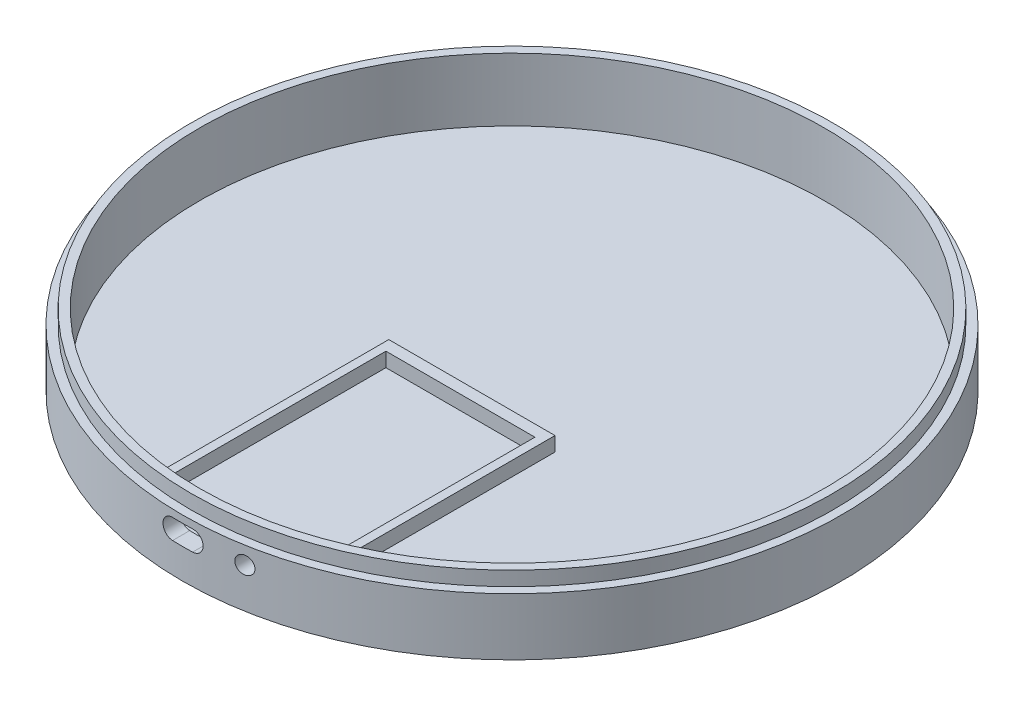
ISO-10303-21;
HEADER;
FILE_DESCRIPTION(('STEP AP214'),'2;1');
FILE_NAME('part.step','',(''),(''),'','','');
FILE_SCHEMA(('AUTOMOTIVE_DESIGN { 1 0 10303 214 1 1 1 1 }'));
ENDSEC;
DATA;
#1=APPLICATION_CONTEXT('core data for automotive mechanical design processes');
#2=APPLICATION_PROTOCOL_DEFINITION('international standard','automotive_design',2000,#1);
#3=PRODUCT_CONTEXT('',#1,'mechanical');
#4=PRODUCT('Part','Part','',(#3));
#5=PRODUCT_RELATED_PRODUCT_CATEGORY('part','',(#4));
#6=PRODUCT_DEFINITION_FORMATION('','',#4);
#7=PRODUCT_DEFINITION_CONTEXT('part definition',#1,'design');
#8=PRODUCT_DEFINITION('design','',#6,#7);
#9=PRODUCT_DEFINITION_SHAPE('','',#8);
#10=(LENGTH_UNIT() NAMED_UNIT(*) SI_UNIT(.MILLI.,.METRE.));
#11=(NAMED_UNIT(*) PLANE_ANGLE_UNIT() SI_UNIT($,.RADIAN.));
#12=(NAMED_UNIT(*) SI_UNIT($,.STERADIAN.) SOLID_ANGLE_UNIT());
#13=UNCERTAINTY_MEASURE_WITH_UNIT(LENGTH_MEASURE(1.E-05),#10,'distance_accuracy_value','');
#14=(GEOMETRIC_REPRESENTATION_CONTEXT(3) GLOBAL_UNCERTAINTY_ASSIGNED_CONTEXT((#13)) GLOBAL_UNIT_ASSIGNED_CONTEXT((#10,
#11,#12)) REPRESENTATION_CONTEXT('',''));
#15=CARTESIAN_POINT('',(0.,0.,0.));
#16=DIRECTION('',(0.,0.,1.));
#17=DIRECTION('',(1.,0.,0.));
#18=AXIS2_PLACEMENT_3D('',#15,#16,#17);
#19=CARTESIAN_POINT('',(0.,20.,0.));
#20=DIRECTION('',(0.,-1.,0.));
#21=DIRECTION('',(0.,0.,-1.));
#22=AXIS2_PLACEMENT_3D('',#19,#20,#21);
#23=CYLINDRICAL_SURFACE('',#22,115.);
#24=CARTESIAN_POINT('',(0.,20.,0.));
#25=DIRECTION('',(0.,1.,0.));
#26=DIRECTION('',(0.,0.,1.));
#27=AXIS2_PLACEMENT_3D('',#24,#25,#26);
#28=CIRCLE('',#27,115.);
#29=CARTESIAN_POINT('',(0.,20.,115.));
#30=VERTEX_POINT('',#29);
#31=EDGE_CURVE('E242',#30,#30,#28,.T.);
#32=ORIENTED_EDGE('',*,*,#31,.F.);
#33=EDGE_LOOP('',(#32));
#34=FACE_BOUND('',#33,.T.);
#35=CARTESIAN_POINT('',(0.,0.,0.));
#36=DIRECTION('',(0.,1.,0.));
#37=DIRECTION('',(0.,0.,1.));
#38=AXIS2_PLACEMENT_3D('',#35,#36,#37);
#39=CIRCLE('',#38,115.);
#40=CARTESIAN_POINT('',(0.,0.,115.));
#41=VERTEX_POINT('',#40);
#42=EDGE_CURVE('E245',#41,#41,#39,.T.);
#43=ORIENTED_EDGE('',*,*,#42,.T.);
#44=EDGE_LOOP('',(#43));
#45=FACE_BOUND('',#44,.T.);
#46=CARTESIAN_POINT('',(0.,10.5,0.));
#47=DIRECTION('',(0.,1.,0.));
#48=DIRECTION('',(0.,0.,1.));
#49=AXIS2_PLACEMENT_3D('',#46,#47,#48);
#50=CIRCLE('',#49,115.);
#51=CARTESIAN_POINT('',(-3.5,10.5,114.946726791153));
#52=VERTEX_POINT('',#51);
#53=CARTESIAN_POINT('',(3.5,10.5,114.946726791153));
#54=VERTEX_POINT('',#53);
#55=EDGE_CURVE('E153',#52,#54,#50,.T.);
#56=ORIENTED_EDGE('',*,*,#55,.F.);
#57=CARTESIAN_POINT('',(-3.5,17.5,114.946726791153));
#58=CARTESIAN_POINT('',(-3.5985085013734,17.5000094239052,114.943728548544));
#59=CARTESIAN_POINT('',(-3.69700840686518,17.4958412138312,114.940601381051));
#60=CARTESIAN_POINT('',(-3.89329476689758,17.4792245324398,114.934119494774));
#61=CARTESIAN_POINT('',(-3.99108125861865,17.4667764957977,114.930764787945));
#62=CARTESIAN_POINT('',(-4.18518500594403,17.4336870886553,114.923860290826));
#63=CARTESIAN_POINT('',(-4.2815032702209,17.4130516331743,114.920310642965));
#64=CARTESIAN_POINT('',(-4.47202899821757,17.3637562129467,114.913054369222));
#65=CARTESIAN_POINT('',(-4.56623648473751,17.3350963349233,114.909347745039));
#66=CARTESIAN_POINT('',(-4.84477792637925,17.2373159129675,114.898052663532));
#67=CARTESIAN_POINT('',(-5.02511751807623,17.1563797273345,114.890285884088));
#68=CARTESIAN_POINT('',(-5.36950741271024,16.9654273228237,114.874706603238));
#69=CARTESIAN_POINT('',(-5.53356071692435,16.8554164756314,114.866894110539));
#70=CARTESIAN_POINT('',(-5.84096970797494,16.6093326995222,114.851672961501));
#71=CARTESIAN_POINT('',(-5.9843163846608,16.4732484847635,114.844264481831));
#72=CARTESIAN_POINT('',(-6.24613821503049,16.178884862841,114.830322663342));
#73=CARTESIAN_POINT('',(-6.36460972039862,16.0206022056138,114.823789452947));
#74=CARTESIAN_POINT('',(-6.57321709790687,15.6864468493145,114.812036665657));
#75=CARTESIAN_POINT('',(-6.6633710483905,15.5105854676917,114.806816251081));
#76=CARTESIAN_POINT('',(-6.81285722025856,15.1461921693224,114.798042738691));
#77=CARTESIAN_POINT('',(-6.87219168694474,14.9576611767296,114.794489519418));
#78=CARTESIAN_POINT('',(-6.95827542124104,14.5735864123909,114.78930385353));
#79=CARTESIAN_POINT('',(-6.98507561069189,14.378054094138,114.787668405404));
#80=CARTESIAN_POINT('',(-7.00548994842089,13.9852545401416,114.786424373809));
#81=CARTESIAN_POINT('',(-6.99910360177368,13.787987278568,114.786815820569));
#82=CARTESIAN_POINT('',(-6.95335300169849,13.3975514131692,114.789596196769));
#83=CARTESIAN_POINT('',(-6.91402515478759,13.2043785258437,114.791982921048));
#84=CARTESIAN_POINT('',(-6.80356683758188,12.8273842364094,114.798582368508));
#85=CARTESIAN_POINT('',(-6.73243639605848,12.6435628258405,114.802795090037));
#86=CARTESIAN_POINT('',(-6.56035623343739,12.2903711385296,114.812756787597));
#87=CARTESIAN_POINT('',(-6.45938988818336,12.1210089862771,114.818506619915));
#88=CARTESIAN_POINT('',(-6.23052997990829,11.8016374731536,114.831152499812));
#89=CARTESIAN_POINT('',(-6.10263748907556,11.6516273420764,114.83804850175));
#90=CARTESIAN_POINT('',(-5.82334289664208,11.3749716754757,114.852549894781));
#91=CARTESIAN_POINT('',(-5.67190665015502,11.2483606681907,114.860156309668));
#92=CARTESIAN_POINT('',(-5.34988350176124,11.0223109269201,114.875605255252));
#93=CARTESIAN_POINT('',(-5.17929040221174,10.9228810225269,114.883447861757));
#94=CARTESIAN_POINT('',(-4.82356273663683,10.7539177915118,114.898933815286));
#95=CARTESIAN_POINT('',(-4.63840398775731,10.6844354797907,114.906576801625));
#96=CARTESIAN_POINT('',(-4.25916695250358,10.5776698323713,114.921257091163));
#97=CARTESIAN_POINT('',(-4.06510278564965,10.5403372627583,114.928295305571));
#98=CARTESIAN_POINT('',(-3.80810902209697,10.5130375919962,114.93694852287));
#99=CARTESIAN_POINT('',(-3.74653678539975,10.5081460481525,114.938972011159));
#100=CARTESIAN_POINT('',(-3.62331853368298,10.5016317027061,114.94292208372));
#101=CARTESIAN_POINT('',(-3.56167280848977,10.5000035155762,114.944848822526));
#102=CARTESIAN_POINT('',(-3.5,10.5,114.946726791153));
#103=B_SPLINE_CURVE_WITH_KNOTS('',3,(#57,#58,#59,#60,#61,#62,#63,#64,#65,#66,#67,#68,#69,#70,
#71,#72,#73,#74,#75,#76,#77,#78,#79,#80,#81,#82,#83,#84,#85,#86,#87,#88,#89,#90,#91,#92,#93,#94,
#95,#96,#97,#98,#99,#100,#101,#102),.UNSPECIFIED.,.F.,.F.,(4,2,2,2,2,2,2,2,2,2,2,2,2,2,2,2,2,2,
2,2,2,2,4),(0.,0.29556580441684,0.591116093409818,0.886453249089045,1.18178721306328,
1.77219454413175,2.36249287072694,2.95304728721114,3.54368825692011,4.13395138271613,
4.72417149984937,5.31346662312127,5.902770534835,6.49142401356984,7.08007695975831,
7.66905851573047,8.25801662312783,8.84783698880906,9.43784872647563,10.0288615983221,
10.6189677790349,10.8043054324249,10.989336969857),.UNSPECIFIED.);
#104=CARTESIAN_POINT('',(-3.5,17.5,114.946726791153));
#105=VERTEX_POINT('',#104);
#106=EDGE_CURVE('E146',#105,#52,#103,.T.);
#107=ORIENTED_EDGE('',*,*,#106,.F.);
#108=CARTESIAN_POINT('',(0.,17.5,0.));
#109=DIRECTION('',(0.,-1.,0.));
#110=DIRECTION('',(0.,0.,-1.));
#111=AXIS2_PLACEMENT_3D('',#108,#109,#110);
#112=CIRCLE('',#111,115.);
#113=CARTESIAN_POINT('',(3.5,17.5,114.946726791153));
#114=VERTEX_POINT('',#113);
#115=EDGE_CURVE('E132',#114,#105,#112,.T.);
#116=ORIENTED_EDGE('',*,*,#115,.F.);
#117=CARTESIAN_POINT('',(3.5,10.5,114.946726791153));
#118=CARTESIAN_POINT('',(3.59850850137341,10.4999905760948,114.943728548544));
#119=CARTESIAN_POINT('',(3.69700840686518,10.5041587861688,114.940601381051));
#120=CARTESIAN_POINT('',(3.89329476689758,10.5207754675602,114.934119494774));
#121=CARTESIAN_POINT('',(3.99108125861865,10.5332235042023,114.930764787945));
#122=CARTESIAN_POINT('',(4.18518500594403,10.5663129113447,114.923860290826));
#123=CARTESIAN_POINT('',(4.2815032702209,10.5869483668257,114.920310642965));
#124=CARTESIAN_POINT('',(4.47202899821757,10.6362437870533,114.913054369222));
#125=CARTESIAN_POINT('',(4.56623648473752,10.6649036650767,114.909347745039));
#126=CARTESIAN_POINT('',(4.84477792637925,10.7626840870325,114.898052663532));
#127=CARTESIAN_POINT('',(5.02511751807624,10.8436202726655,114.890285884088));
#128=CARTESIAN_POINT('',(5.36950741271025,11.0345726771763,114.874706603238));
#129=CARTESIAN_POINT('',(5.53356071692436,11.1445835243686,114.866894110539));
#130=CARTESIAN_POINT('',(5.84096970797494,11.3906673004778,114.851672961501));
#131=CARTESIAN_POINT('',(5.98431638466081,11.5267515152365,114.844264481831));
#132=CARTESIAN_POINT('',(6.24613821503049,11.821115137159,114.830322663342));
#133=CARTESIAN_POINT('',(6.36460972039863,11.9793977943862,114.823789452947));
#134=CARTESIAN_POINT('',(6.57321709790687,12.3135531506855,114.812036665657));
#135=CARTESIAN_POINT('',(6.66337104839051,12.4894145323083,114.806816251081));
#136=CARTESIAN_POINT('',(6.81285722025856,12.8538078306776,114.798042738691));
#137=CARTESIAN_POINT('',(6.87219168694474,13.0423388232704,114.794489519418));
#138=CARTESIAN_POINT('',(6.95827542124104,13.4264135876091,114.78930385353));
#139=CARTESIAN_POINT('',(6.98507561069189,13.621945905862,114.787668405404));
#140=CARTESIAN_POINT('',(7.0054899484209,14.0147454598584,114.786424373809));
#141=CARTESIAN_POINT('',(6.99910360177368,14.212012721432,114.786815820569));
#142=CARTESIAN_POINT('',(6.95335300169849,14.6024485868308,114.789596196769));
#143=CARTESIAN_POINT('',(6.91402515478759,14.7956214741563,114.791982921048));
#144=CARTESIAN_POINT('',(6.80356683758188,15.1726157635906,114.798582368508));
#145=CARTESIAN_POINT('',(6.73243639605848,15.3564371741595,114.802795090037));
#146=CARTESIAN_POINT('',(6.5603562334374,15.7096288614704,114.812756787597));
#147=CARTESIAN_POINT('',(6.45938988818337,15.8789910137229,114.818506619915));
#148=CARTESIAN_POINT('',(6.2305299799083,16.1983625268464,114.831152499812));
#149=CARTESIAN_POINT('',(6.10263748907556,16.3483726579236,114.83804850175));
#150=CARTESIAN_POINT('',(5.82334289664208,16.6250283245243,114.852549894781));
#151=CARTESIAN_POINT('',(5.67190665015502,16.7516393318093,114.860156309668));
#152=CARTESIAN_POINT('',(5.34988350176125,16.9776890730799,114.875605255252));
#153=CARTESIAN_POINT('',(5.17929040221174,17.0771189774731,114.883447861757));
#154=CARTESIAN_POINT('',(4.82356273663684,17.2460822084882,114.898933815286));
#155=CARTESIAN_POINT('',(4.63840398775731,17.3155645202093,114.906576801625));
#156=CARTESIAN_POINT('',(4.25916695250359,17.4223301676287,114.921257091163));
#157=CARTESIAN_POINT('',(4.06510278564966,17.4596627372417,114.928295305571));
#158=CARTESIAN_POINT('',(3.80810902209697,17.4869624080038,114.93694852287));
#159=CARTESIAN_POINT('',(3.74653678539975,17.4918539518475,114.938972011159));
#160=CARTESIAN_POINT('',(3.62331853368299,17.4983682972939,114.94292208372));
#161=CARTESIAN_POINT('',(3.56167280848978,17.4999964844238,114.944848822526));
#162=CARTESIAN_POINT('',(3.5,17.5,114.946726791153));
#163=B_SPLINE_CURVE_WITH_KNOTS('',3,(#117,#118,#119,#120,#121,#122,#123,#124,#125,#126,#127,
#128,#129,#130,#131,#132,#133,#134,#135,#136,#137,#138,#139,#140,#141,#142,#143,#144,#145,#146,
#147,#148,#149,#150,#151,#152,#153,#154,#155,#156,#157,#158,#159,#160,#161,#162),.UNSPECIFIED.,
.F.,.F.,(4,2,2,2,2,2,2,2,2,2,2,2,2,2,2,2,2,2,2,2,2,2,4),(0.,0.29556580441684,0.591116093409817,
0.886453249089046,1.18178721306328,1.77219454413175,2.36249287072694,2.95304728721114,
3.54368825692011,4.13395138271613,4.72417149984937,5.31346662312127,5.902770534835,
6.49142401356984,7.08007695975831,7.66905851573047,8.25801662312783,8.84783698880907,
9.43784872647563,10.0288615983221,10.6189677790349,10.8043054324249,10.989336969857),.UNSPECIFIED.);
#164=EDGE_CURVE('E139',#54,#114,#163,.T.);
#165=ORIENTED_EDGE('',*,*,#164,.F.);
#166=EDGE_LOOP('',(#56,#107,#116,#165));
#167=FACE_BOUND('',#166,.T.);
#168=CARTESIAN_POINT('',(17.,14.,113.736537664903));
#169=CARTESIAN_POINT('',(17.0000076037659,13.8329299845572,113.736536861572));
#170=CARTESIAN_POINT('',(17.0140055325356,13.6657386059629,113.734447014156));
#171=CARTESIAN_POINT('',(17.0696240128967,13.3359824956676,113.726112637898));
#172=CARTESIAN_POINT('',(17.1112777247502,13.1734235627622,113.719863121444));
#173=CARTESIAN_POINT('',(17.2209326208956,12.8577797328031,113.703309252892));
#174=CARTESIAN_POINT('',(17.2889159788996,12.7046885068618,113.693007644158));
#175=CARTESIAN_POINT('',(17.4491765502099,12.412200366875,113.668521483922));
#176=CARTESIAN_POINT('',(17.5414480827759,12.2728002610801,113.654337840354));
#177=CARTESIAN_POINT('',(17.7480220859138,12.0108965720493,113.622263012289));
#178=CARTESIAN_POINT('',(17.8624195547004,11.8884699028823,113.604355814792));
#179=CARTESIAN_POINT('',(18.109641632172,11.6645413498248,113.565208198503));
#180=CARTESIAN_POINT('',(18.2424677748503,11.5630412095983,113.543967502213));
#181=CARTESIAN_POINT('',(18.5242268339043,11.382679483773,113.498341702713));
#182=CARTESIAN_POINT('',(18.6733151717836,11.3040685518183,113.473925733624));
#183=CARTESIAN_POINT('',(18.9821702146336,11.1729565951293,113.422668379897));
#184=CARTESIAN_POINT('',(19.1419376305339,11.1204573106723,113.395826833742));
#185=CARTESIAN_POINT('',(19.4697652069872,11.0423656781676,113.340002729801));
#186=CARTESIAN_POINT('',(19.6379049291911,11.0171236003961,113.31099730607));
#187=CARTESIAN_POINT('',(19.9758479358016,10.9953215437936,113.2519091547));
#188=CARTESIAN_POINT('',(20.145651326207,10.9987634045543,113.221826358088));
#189=CARTESIAN_POINT('',(20.4839039288119,11.0343560868977,113.161121857357));
#190=CARTESIAN_POINT('',(20.6523225833238,11.0667938682817,113.130497772913));
#191=CARTESIAN_POINT('',(20.9813115646977,11.1598847765089,113.069945435389));
#192=CARTESIAN_POINT('',(21.1418816458305,11.2205387861435,113.040017204108));
#193=CARTESIAN_POINT('',(21.4508513709812,11.3685707534622,112.981793898937));
#194=CARTESIAN_POINT('',(21.59923100915,11.4559915695115,112.953501531356));
#195=CARTESIAN_POINT('',(21.8791911184116,11.6551865373517,112.899607389703));
#196=CARTESIAN_POINT('',(22.0107722543562,11.7669597248493,112.874005509154));
#197=CARTESIAN_POINT('',(22.2519581726013,12.0105845661382,112.826704936999));
#198=CARTESIAN_POINT('',(22.3617678112301,12.1422262733568,112.804970080331));
#199=CARTESIAN_POINT('',(22.5576276523615,12.4227266709848,112.76596756726));
#200=CARTESIAN_POINT('',(22.6436803296472,12.5715835657791,112.748699445564));
#201=CARTESIAN_POINT('',(22.7879479525309,12.8794119804471,112.719629045182));
#202=CARTESIAN_POINT('',(22.8466378723095,13.0381520955465,112.707733628429));
#203=CARTESIAN_POINT('',(22.9365599392397,13.3635290769868,112.689468657235));
#204=CARTESIAN_POINT('',(22.9677950575468,13.5301650867773,112.683098504851));
#205=CARTESIAN_POINT('',(23.0015053152803,13.8636495431806,112.676222188204));
#206=CARTESIAN_POINT('',(23.0044469732368,14.0304490184697,112.675620904005));
#207=CARTESIAN_POINT('',(22.9826944860259,14.362154021548,112.680059788688));
#208=CARTESIAN_POINT('',(22.9580015944298,14.5270596349046,112.685099701672));
#209=CARTESIAN_POINT('',(22.8819658754304,14.849450671138,112.700563956412));
#210=CARTESIAN_POINT('',(22.8307583711056,15.0069693842517,112.710960955808));
#211=CARTESIAN_POINT('',(22.7033608345119,15.3111170287743,112.736691478646));
#212=CARTESIAN_POINT('',(22.6271699245559,15.4577455773809,112.752025175517));
#213=CARTESIAN_POINT('',(22.4512737697688,15.737471471685,112.787181868893));
#214=CARTESIAN_POINT('',(22.3513562541562,15.8704301648866,112.807045323389));
#215=CARTESIAN_POINT('',(22.1313321077552,16.1177404747935,112.850417296642));
#216=CARTESIAN_POINT('',(22.0112236790184,16.2320904326532,112.873926139997));
#217=CARTESIAN_POINT('',(21.7518978634687,16.4411231201068,112.924189877663));
#218=CARTESIAN_POINT('',(21.6123766397671,16.5354167333598,112.950995387733));
#219=CARTESIAN_POINT('',(21.3198567142432,16.6992759566526,113.00657438863));
#220=CARTESIAN_POINT('',(21.1668567668883,16.7688392784355,113.035348061274));
#221=CARTESIAN_POINT('',(20.84897227651,16.8823942840238,113.094415826361));
#222=CARTESIAN_POINT('',(20.6839332072744,16.9259447521079,113.124727179163));
#223=CARTESIAN_POINT('',(20.3488840634296,16.9844941897738,113.185475654976));
#224=CARTESIAN_POINT('',(20.1788737192014,16.9994916078431,113.215912784732));
#225=CARTESIAN_POINT('',(19.837407128636,17.0004864231032,113.27624440519));
#226=CARTESIAN_POINT('',(19.6659492437521,16.9862754576982,113.306133451773));
#227=CARTESIAN_POINT('',(19.327708849036,16.9287288504858,113.364320354062));
#228=CARTESIAN_POINT('',(19.1609263039453,16.885393428379,113.392618221769));
#229=CARTESIAN_POINT('',(18.837534769527,16.7709165347538,113.446789633869));
#230=CARTESIAN_POINT('',(18.6808879052317,16.6998865008844,113.472672385312));
#231=CARTESIAN_POINT('',(18.3816821658292,16.5318919169874,113.521525557586));
#232=CARTESIAN_POINT('',(18.2391219635214,16.4349298133939,113.544496252838));
#233=CARTESIAN_POINT('',(17.9739120350165,16.2189816872165,113.58677893863));
#234=CARTESIAN_POINT('',(17.8510542188328,16.1002588116027,113.606129584954));
#235=CARTESIAN_POINT('',(17.6270022657321,15.8433470055005,113.641109139956));
#236=CARTESIAN_POINT('',(17.5258120714551,15.7051545398977,113.656737371362));
#237=CARTESIAN_POINT('',(17.3493373489406,15.4150875105717,113.683808843809));
#238=CARTESIAN_POINT('',(17.2737526772076,15.263399822788,113.695300678573));
#239=CARTESIAN_POINT('',(17.1491853812479,14.9493767671334,113.714156766774));
#240=CARTESIAN_POINT('',(17.1001688559531,14.7870552660721,113.721526280696));
#241=CARTESIAN_POINT('',(17.0435096078379,14.519704530293,113.730027792359));
#242=CARTESIAN_POINT('',(17.0272151714998,14.4164696060634,113.732467071757));
#243=CARTESIAN_POINT('',(17.0054580200732,14.20883892693,113.735722254749));
#244=CARTESIAN_POINT('',(16.999995246535,14.1044431782932,113.736538167103));
#245=CARTESIAN_POINT('',(17.,14.,113.736537664903));
#246=B_SPLINE_CURVE_WITH_KNOTS('',3,(#168,#169,#170,#171,#172,#173,#174,#175,#176,#177,#178,
#179,#180,#181,#182,#183,#184,#185,#186,#187,#188,#189,#190,#191,#192,#193,#194,#195,#196,#197,
#198,#199,#200,#201,#202,#203,#204,#205,#206,#207,#208,#209,#210,#211,#212,#213,#214,#215,#216,
#217,#218,#219,#220,#221,#222,#223,#224,#225,#226,#227,#228,#229,#230,#231,#232,#233,#234,#235,
#236,#237,#238,#239,#240,#241,#242,#243,#244,#245),.UNSPECIFIED.,.T.,.F.,(4,2,2,2,2,2,2,2,2,2,2,
2,2,2,2,2,2,2,2,2,2,2,2,2,2,2,2,2,2,2,2,2,2,2,2,2,2,2,4),(0.,0.50082692801102,1.00225545232396,
1.50334508004562,2.00431761232114,2.50749084613969,3.01070598899561,3.5192406037803,
4.02780910660837,4.54283795247175,5.05789982901808,5.57811617971013,6.09834880732471,
6.61941881395757,7.14046819126343,7.65635415763165,8.17218636341728,8.67869654855052,
9.18515191245745,9.68324194760036,10.1813093890642,10.6768595314922,11.1724270848618,
11.6726073910269,12.1728322605613,12.6820202929838,13.1912554275602,13.70889924753,
14.2265711943709,14.747948850072,15.2693225728013,15.7886196886521,16.3078678312298,
16.8212078352747,17.334641167426,17.8418291103628,18.3483683465942,18.6614600660373,
18.9745500959727),.UNSPECIFIED.);
#247=CARTESIAN_POINT('',(17.,14.,113.736537664903));
#248=VERTEX_POINT('',#247);
#249=EDGE_CURVE('E150',#248,#248,#246,.T.);
#250=ORIENTED_EDGE('',*,*,#249,.F.);
#251=EDGE_LOOP('',(#250));
#252=FACE_BOUND('',#251,.T.);
#253=ADVANCED_FACE('F38',(#34,#45,#167,#252),#23,.T.);
#254=CARTESIAN_POINT('',(0.,3.,0.));
#255=DIRECTION('',(0.,1.,0.));
#256=DIRECTION('',(0.,0.,1.));
#257=AXIS2_PLACEMENT_3D('',#254,#255,#256);
#258=CYLINDRICAL_SURFACE('',#257,109.);
#259=CARTESIAN_POINT('',(0.,25.,0.));
#260=DIRECTION('',(0.,1.,0.));
#261=DIRECTION('',(0.,0.,1.));
#262=AXIS2_PLACEMENT_3D('',#259,#260,#261);
#263=CIRCLE('',#262,109.);
#264=CARTESIAN_POINT('',(0.,25.,109.));
#265=VERTEX_POINT('',#264);
#266=EDGE_CURVE('E256',#265,#265,#263,.T.);
#267=ORIENTED_EDGE('',*,*,#266,.T.);
#268=EDGE_LOOP('',(#267));
#269=FACE_BOUND('',#268,.T.);
#270=CARTESIAN_POINT('',(0.,3.,0.));
#271=DIRECTION('',(0.,1.,0.));
#272=DIRECTION('',(0.,0.,1.));
#273=AXIS2_PLACEMENT_3D('',#270,#271,#272);
#274=CIRCLE('',#273,109.);
#275=CARTESIAN_POINT('',(0.,3.,109.));
#276=VERTEX_POINT('',#275);
#277=EDGE_CURVE('E251',#276,#276,#274,.T.);
#278=ORIENTED_EDGE('',*,*,#277,.F.);
#279=EDGE_LOOP('',(#278));
#280=FACE_BOUND('',#279,.T.);
#281=CARTESIAN_POINT('',(-3.5,10.5,108.943792847505));
#282=CARTESIAN_POINT('',(-3.59851618984445,10.4999905768354,108.940629151436));
#283=CARTESIAN_POINT('',(-3.69702331624595,10.5041594347708,108.937329406074));
#284=CARTESIAN_POINT('',(-3.89332307456706,10.5207784765715,108.930489790969));
#285=CARTESIAN_POINT('',(-3.99111574409017,10.5332282213738,108.926949933967));
#286=CARTESIAN_POINT('',(-4.18523059252203,10.5663218438837,108.919664363145));
#287=CARTESIAN_POINT('',(-4.28155378379502,10.5869597887568,108.915918800061));
#288=CARTESIAN_POINT('',(-4.47208839611891,10.6362608062062,108.908262016913));
#289=CARTESIAN_POINT('',(-4.56629983965903,10.6649237932753,108.904350798615));
#290=CARTESIAN_POINT('',(-4.84485134377098,10.762714071784,108.892432259241));
#291=CARTESIAN_POINT('',(-5.02519574046097,10.8436576227949,108.884236749621));
#292=CARTESIAN_POINT('',(-5.36959334463901,11.0346263557042,108.867797362642));
#293=CARTESIAN_POINT('',(-5.53364953209816,11.1446462044792,108.859553494423));
#294=CARTESIAN_POINT('',(-5.84107041232922,11.3907563361603,108.843491376811));
#295=CARTESIAN_POINT('',(-5.98442512187529,11.526859124351,108.835673333896));
#296=CARTESIAN_POINT('',(-6.24625920403474,11.8212658250942,108.820960750481));
#297=CARTESIAN_POINT('',(-6.36473494391507,11.9795729742225,108.8140663449));
#298=CARTESIAN_POINT('',(-6.57333804105563,12.3137723009663,108.801664399421));
#299=CARTESIAN_POINT('',(-6.66348538440866,12.4896519649371,108.796155882308));
#300=CARTESIAN_POINT('',(-6.81295409076433,12.854085298693,108.786898556988));
#301=CARTESIAN_POINT('',(-6.872277730691,13.0426380311656,108.783149618805));
#302=CARTESIAN_POINT('',(-6.95832573407515,13.4267227476731,108.777679593941));
#303=CARTESIAN_POINT('',(-6.98510687462673,13.6222419617897,108.775954975595));
#304=CARTESIAN_POINT('',(-7.00548795266009,14.0150130028138,108.774644325904));
#305=CARTESIAN_POINT('',(-6.99908742560592,14.2122648539393,108.775058324499));
#306=CARTESIAN_POINT('',(-6.95331692971273,14.6026423412739,108.777993625446));
#307=CARTESIAN_POINT('',(-6.9139874404251,14.7957727451923,108.780512340465));
#308=CARTESIAN_POINT('',(-6.80354091720756,15.1726816648465,108.787475690414));
#309=CARTESIAN_POINT('',(-6.73242390377593,15.3564601866127,108.791920324103));
#310=CARTESIAN_POINT('',(-6.56038142979575,15.7095797755056,108.80243007664));
#311=CARTESIAN_POINT('',(-6.45943754797209,15.8789118368642,108.808496196709));
#312=CARTESIAN_POINT('',(-6.23063507698886,16.1982285240698,108.821837297587));
#313=CARTESIAN_POINT('',(-6.10277753094025,16.3482138993861,108.829112231543));
#314=CARTESIAN_POINT('',(-5.8235381198459,16.6248549945965,108.844411640586));
#315=CARTESIAN_POINT('',(-5.67211789896186,16.7514719268893,108.852437329118));
#316=CARTESIAN_POINT('',(-5.35012727061389,16.9775370443885,108.868737827063));
#317=CARTESIAN_POINT('',(-5.17955065146969,17.076976380852,108.877012716643));
#318=CARTESIAN_POINT('',(-4.82383178649186,17.2459734186332,108.89335335713));
#319=CARTESIAN_POINT('',(-4.6386635941247,17.3154764014138,108.901418699958));
#320=CARTESIAN_POINT('',(-4.25940129524997,17.4222791576432,108.916910284801));
#321=CARTESIAN_POINT('',(-4.0653213198117,17.4596281773296,108.924337488412));
#322=CARTESIAN_POINT('',(-3.80827612170106,17.4869482286987,108.93346991442));
#323=CARTESIAN_POINT('',(-3.7466708511858,17.4918450768967,108.935606148605));
#324=CARTESIAN_POINT('',(-3.62338595293787,17.4983665086844,108.939776267071));
#325=CARTESIAN_POINT('',(-3.56170661603067,17.4999964830526,108.941810314555));
#326=CARTESIAN_POINT('',(-3.5,17.5,108.943792847505));
#327=B_SPLINE_CURVE_WITH_KNOTS('',3,(#281,#282,#283,#284,#285,#286,#287,#288,#289,#290,#291,
#292,#293,#294,#295,#296,#297,#298,#299,#300,#301,#302,#303,#304,#305,#306,#307,#308,#309,#310,
#311,#312,#313,#314,#315,#316,#317,#318,#319,#320,#321,#322,#323,#324,#325,#326),.UNSPECIFIED.,
.F.,.F.,(4,2,2,2,2,2,2,2,2,2,2,2,2,2,2,2,2,2,2,2,2,2,4),(0.,0.29560431670293,0.591192961338503,
0.886567824527307,1.18193954060239,1.77242082834336,2.36279388612324,2.95345070552214,
3.54419371051742,4.13451899718909,4.72480067076954,5.31405099079784,5.90330956022145,
6.49184481622398,7.08037969270847,7.66927881476761,8.2581551166692,8.84800023017913,
9.43803716296209,10.0291480522831,10.6193519915039,10.8048008970972,10.9899435344215),.UNSPECIFIED.);
#328=CARTESIAN_POINT('',(-3.5,10.5,108.943792847505));
#329=VERTEX_POINT('',#328);
#330=CARTESIAN_POINT('',(-3.5,17.5,108.943792847505));
#331=VERTEX_POINT('',#330);
#332=EDGE_CURVE('E11',#329,#331,#327,.T.);
#333=ORIENTED_EDGE('',*,*,#332,.F.);
#334=CARTESIAN_POINT('',(0.,10.5,0.));
#335=DIRECTION('',(0.,1.,0.));
#336=DIRECTION('',(0.,0.,1.));
#337=AXIS2_PLACEMENT_3D('',#334,#335,#336);
#338=CIRCLE('',#337,109.);
#339=CARTESIAN_POINT('',(3.5,10.5,108.943792847505));
#340=VERTEX_POINT('',#339);
#341=EDGE_CURVE('E52',#340,#329,#338,.F.);
#342=ORIENTED_EDGE('',*,*,#341,.F.);
#343=CARTESIAN_POINT('',(3.5,17.5,108.943792847505));
#344=CARTESIAN_POINT('',(3.59851618984446,17.5000094231646,108.940629151436));
#345=CARTESIAN_POINT('',(3.69702331624595,17.4958405652292,108.937329406074));
#346=CARTESIAN_POINT('',(3.89332307456706,17.4792215234285,108.930489790969));
#347=CARTESIAN_POINT('',(3.99111574409017,17.4667717786262,108.926949933967));
#348=CARTESIAN_POINT('',(4.18523059252203,17.4336781561163,108.919664363145));
#349=CARTESIAN_POINT('',(4.28155378379502,17.4130402112432,108.915918800061));
#350=CARTESIAN_POINT('',(4.47208839611891,17.3637391937938,108.908262016913));
#351=CARTESIAN_POINT('',(4.56629983965903,17.3350762067247,108.904350798615));
#352=CARTESIAN_POINT('',(4.84485134377098,17.237285928216,108.892432259241));
#353=CARTESIAN_POINT('',(5.02519574046098,17.1563423772051,108.884236749621));
#354=CARTESIAN_POINT('',(5.36959334463901,16.9653736442958,108.867797362642));
#355=CARTESIAN_POINT('',(5.53364953209816,16.8553537955208,108.859553494423));
#356=CARTESIAN_POINT('',(5.84107041232922,16.6092436638397,108.843491376811));
#357=CARTESIAN_POINT('',(5.98442512187529,16.473140875649,108.835673333896));
#358=CARTESIAN_POINT('',(6.24625920403474,16.1787341749058,108.820960750481));
#359=CARTESIAN_POINT('',(6.36473494391507,16.0204270257775,108.8140663449));
#360=CARTESIAN_POINT('',(6.57333804105563,15.6862276990337,108.801664399421));
#361=CARTESIAN_POINT('',(6.66348538440866,15.5103480350629,108.796155882308));
#362=CARTESIAN_POINT('',(6.81295409076434,15.145914701307,108.786898556988));
#363=CARTESIAN_POINT('',(6.87227773069101,14.9573619688344,108.783149618805));
#364=CARTESIAN_POINT('',(6.95832573407516,14.5732772523269,108.777679593941));
#365=CARTESIAN_POINT('',(6.98510687462674,14.3777580382103,108.775954975595));
#366=CARTESIAN_POINT('',(7.00548795266009,13.9849869971862,108.774644325904));
#367=CARTESIAN_POINT('',(6.99908742560592,13.7877351460608,108.775058324499));
#368=CARTESIAN_POINT('',(6.95331692971274,13.3973576587261,108.777993625446));
#369=CARTESIAN_POINT('',(6.9139874404251,13.2042272548077,108.780512340465));
#370=CARTESIAN_POINT('',(6.80354091720756,12.8273183351535,108.787475690414));
#371=CARTESIAN_POINT('',(6.73242390377594,12.6435398133873,108.791920324103));
#372=CARTESIAN_POINT('',(6.56038142979576,12.2904202244944,108.80243007664));
#373=CARTESIAN_POINT('',(6.45943754797209,12.1210881631358,108.808496196709));
#374=CARTESIAN_POINT('',(6.23063507698886,11.8017714759302,108.821837297587));
#375=CARTESIAN_POINT('',(6.10277753094025,11.6517861006139,108.829112231543));
#376=CARTESIAN_POINT('',(5.82353811984591,11.3751450054035,108.844411640586));
#377=CARTESIAN_POINT('',(5.67211789896187,11.2485280731107,108.852437329118));
#378=CARTESIAN_POINT('',(5.35012727061389,11.0224629556115,108.868737827063));
#379=CARTESIAN_POINT('',(5.17955065146969,10.923023619148,108.877012716643));
#380=CARTESIAN_POINT('',(4.82383178649187,10.7540265813668,108.89335335713));
#381=CARTESIAN_POINT('',(4.63866359412471,10.6845235985862,108.901418699958));
#382=CARTESIAN_POINT('',(4.25940129524998,10.5777208423568,108.916910284801));
#383=CARTESIAN_POINT('',(4.06532131981171,10.5403718226704,108.924337488412));
#384=CARTESIAN_POINT('',(3.80827612170106,10.5130517713013,108.93346991442));
#385=CARTESIAN_POINT('',(3.7466708511858,10.5081549231033,108.935606148605));
#386=CARTESIAN_POINT('',(3.62338595293787,10.5016334913156,108.939776267071));
#387=CARTESIAN_POINT('',(3.56170661603067,10.5000035169474,108.941810314555));
#388=CARTESIAN_POINT('',(3.5,10.5,108.943792847505));
#389=B_SPLINE_CURVE_WITH_KNOTS('',3,(#343,#344,#345,#346,#347,#348,#349,#350,#351,#352,#353,
#354,#355,#356,#357,#358,#359,#360,#361,#362,#363,#364,#365,#366,#367,#368,#369,#370,#371,#372,
#373,#374,#375,#376,#377,#378,#379,#380,#381,#382,#383,#384,#385,#386,#387,#388),.UNSPECIFIED.,
.F.,.F.,(4,2,2,2,2,2,2,2,2,2,2,2,2,2,2,2,2,2,2,2,2,2,4),(0.,0.29560431670293,0.591192961338503,
0.886567824527307,1.18193954060239,1.77242082834336,2.36279388612324,2.95345070552214,
3.54419371051742,4.13451899718908,4.72480067076954,5.31405099079783,5.90330956022145,
6.49184481622398,7.08037969270847,7.66927881476761,8.2581551166692,8.84800023017913,
9.43803716296209,10.0291480522831,10.6193519915039,10.8048008970972,10.9899435344215),.UNSPECIFIED.);
#390=CARTESIAN_POINT('',(3.5,17.5,108.943792847505));
#391=VERTEX_POINT('',#390);
#392=EDGE_CURVE('E197',#391,#340,#389,.T.);
#393=ORIENTED_EDGE('',*,*,#392,.F.);
#394=CARTESIAN_POINT('',(0.,17.5,0.));
#395=DIRECTION('',(0.,-1.,0.));
#396=DIRECTION('',(0.,0.,-1.));
#397=AXIS2_PLACEMENT_3D('',#394,#395,#396);
#398=CIRCLE('',#397,109.);
#399=EDGE_CURVE('E203',#331,#391,#398,.F.);
#400=ORIENTED_EDGE('',*,*,#399,.F.);
#401=EDGE_LOOP('',(#333,#342,#393,#400));
#402=FACE_BOUND('',#401,.T.);
#403=CARTESIAN_POINT('',(17.,14.,107.666150669558));
#404=CARTESIAN_POINT('',(17.0000076194101,14.1669061236991,107.666149817944));
#405=CARTESIAN_POINT('',(17.013978358655,14.3339335722984,107.663946431303));
#406=CARTESIAN_POINT('',(17.0694856667639,14.6633638638539,107.655159734978));
#407=CARTESIAN_POINT('',(17.111055333384,14.825760909667,107.648571166382));
#408=CARTESIAN_POINT('',(17.2204777965632,15.1410851376417,107.631120938965));
#409=CARTESIAN_POINT('',(17.2883122128538,15.2940188556973,107.62026226831));
#410=CARTESIAN_POINT('',(17.4482030625342,15.5862117865056,107.594454948107));
#411=CARTESIAN_POINT('',(17.5402538704931,15.7254741647863,107.579507248403));
#412=CARTESIAN_POINT('',(17.746357734819,15.9872028317186,107.545700575669));
#413=CARTESIAN_POINT('',(17.8605158443035,16.10958394715,107.526822894028));
#414=CARTESIAN_POINT('',(18.1071981819294,16.3334634109969,107.485557093147));
#415=CARTESIAN_POINT('',(18.2397240267619,16.4349599192352,107.463168664875));
#416=CARTESIAN_POINT('',(18.5209912712909,16.6154894079154,107.415052224974));
#417=CARTESIAN_POINT('',(18.6699051922594,16.6942438876574,107.389288002961));
#418=CARTESIAN_POINT('',(18.9783917628381,16.8256739368688,107.335199972638));
#419=CARTESIAN_POINT('',(19.1379652012024,16.8783475740474,107.306875974863));
#420=CARTESIAN_POINT('',(19.4656327447,16.9568959379827,107.247924089135));
#421=CARTESIAN_POINT('',(19.6338154823415,16.9823808058519,107.217269266511));
#422=CARTESIAN_POINT('',(19.9718617503929,17.0046476353707,107.154814575899));
#423=CARTESIAN_POINT('',(20.1417254002562,17.0014275422693,107.123014626104));
#424=CARTESIAN_POINT('',(20.4803264933951,16.9662399224606,107.058798102273));
#425=CARTESIAN_POINT('',(20.6490300934145,16.9339512819845,107.026378609526));
#426=CARTESIAN_POINT('',(20.9786077885821,16.8410634301366,106.962265398442));
#427=CARTESIAN_POINT('',(21.1394816069554,16.7804632187801,106.930571705781));
#428=CARTESIAN_POINT('',(21.4491069533118,16.6324111895362,106.868895376385));
#429=CARTESIAN_POINT('',(21.597835455187,16.5449098004066,106.838916020659));
#430=CARTESIAN_POINT('',(21.8784729100527,16.3454153575113,106.781800696938));
#431=CARTESIAN_POINT('',(22.0103825999389,16.233423377355,106.754664604378));
#432=CARTESIAN_POINT('',(22.2520308884694,15.9893523520152,106.704555747438));
#433=CARTESIAN_POINT('',(22.3619976048346,15.8575080459102,106.681540433493));
#434=CARTESIAN_POINT('',(22.5581226440943,15.5765007977523,106.64024185057));
#435=CARTESIAN_POINT('',(22.6442837560836,15.4273398874452,106.621958027259));
#436=CARTESIAN_POINT('',(22.7885237458934,15.1191507414155,106.591221686376));
#437=CARTESIAN_POINT('',(22.8471338760161,14.9603821393315,106.578659013256));
#438=CARTESIAN_POINT('',(22.9368947900468,14.6349273580254,106.559377759075));
#439=CARTESIAN_POINT('',(22.9680489064656,14.468242142282,106.552658468767));
#440=CARTESIAN_POINT('',(23.0015512557792,14.1349853711715,106.54543129498));
#441=CARTESIAN_POINT('',(23.0044200837565,13.9684684002343,106.544811156209));
#442=CARTESIAN_POINT('',(22.9826169408654,13.6373391770585,106.549516374487));
#443=CARTESIAN_POINT('',(22.9579463546863,13.4727268294754,106.554841432609));
#444=CARTESIAN_POINT('',(22.8820814245015,13.1510187000877,106.571158514539));
#445=CARTESIAN_POINT('',(22.8310371035488,12.993885836248,106.582118483279));
#446=CARTESIAN_POINT('',(22.7041100965859,12.6904834779265,106.609228361521));
#447=CARTESIAN_POINT('',(22.628226438809,12.5442144087338,106.625378474074));
#448=CARTESIAN_POINT('',(22.4530023687795,12.2649993698846,106.662414916508));
#449=CARTESIAN_POINT('',(22.3534265033092,12.1322075644448,106.683348698038));
#450=CARTESIAN_POINT('',(22.1341883207128,11.8851660166317,106.729050490206));
#451=CARTESIAN_POINT('',(22.014524024933,11.7709181029618,106.753818878523));
#452=CARTESIAN_POINT('',(21.7559195418402,11.5617736783351,106.8068242077));
#453=CARTESIAN_POINT('',(21.6166420991978,11.467309239758,106.835120544398));
#454=CARTESIAN_POINT('',(21.3246209566244,11.3030663341498,106.89379169532));
#455=CARTESIAN_POINT('',(21.1718758736406,11.2332904061904,106.924166722942));
#456=CARTESIAN_POINT('',(20.8541918021201,11.1191385132816,106.986584861413));
#457=CARTESIAN_POINT('',(20.6890799822815,11.0752542838614,107.018648396015));
#458=CARTESIAN_POINT('',(20.3538310532283,11.0160794899518,107.082915011942));
#459=CARTESIAN_POINT('',(20.1836936399572,11.0007906591438,107.11511810161));
#460=CARTESIAN_POINT('',(19.8417633739008,10.9992631951624,107.178985393205));
#461=CARTESIAN_POINT('',(19.669968192882,11.0132586666091,107.210643196942));
#462=CARTESIAN_POINT('',(19.331004571346,11.0704972053784,107.27227948793));
#463=CARTESIAN_POINT('',(19.1638360919562,11.1137400268927,107.302257989293));
#464=CARTESIAN_POINT('',(18.8397193231293,11.2281498997224,107.359638434229));
#465=CARTESIAN_POINT('',(18.6827292121433,11.2991929589487,107.387051157824));
#466=CARTESIAN_POINT('',(18.3828359623823,11.4673481220968,107.438794303808));
#467=CARTESIAN_POINT('',(18.239931404125,11.564457595476,107.463125036857));
#468=CARTESIAN_POINT('',(17.974249638471,11.7806976703461,107.507880201918));
#469=CARTESIAN_POINT('',(17.8512403571168,11.8995336741789,107.528350221123));
#470=CARTESIAN_POINT('',(17.6269092303202,12.1567537546845,107.56535238746));
#471=CARTESIAN_POINT('',(17.5255911594512,12.2951412266424,107.581883849284));
#472=CARTESIAN_POINT('',(17.3490487316986,12.5854535854377,107.610494020361));
#473=CARTESIAN_POINT('',(17.2734876597583,12.7371683369203,107.622630328934));
#474=CARTESIAN_POINT('',(17.1489693963522,13.0512677710352,107.642542075674));
#475=CARTESIAN_POINT('',(17.0999780514778,13.213638453681,107.650323112634));
#476=CARTESIAN_POINT('',(17.0434043808098,13.4809205449361,107.659290390095));
#477=CARTESIAN_POINT('',(17.0271494943639,13.5840312209187,107.661860946664));
#478=CARTESIAN_POINT('',(17.0054449553072,13.7914121380054,107.665291347392));
#479=CARTESIAN_POINT('',(16.9999952378093,13.8956823721423,107.666151201824));
#480=CARTESIAN_POINT('',(17.,14.,107.666150669558));
#481=B_SPLINE_CURVE_WITH_KNOTS('',3,(#403,#404,#405,#406,#407,#408,#409,#410,#411,#412,#413,
#414,#415,#416,#417,#418,#419,#420,#421,#422,#423,#424,#425,#426,#427,#428,#429,#430,#431,#432,
#433,#434,#435,#436,#437,#438,#439,#440,#441,#442,#443,#444,#445,#446,#447,#448,#449,#450,#451,
#452,#453,#454,#455,#456,#457,#458,#459,#460,#461,#462,#463,#464,#465,#466,#467,#468,#469,#470,
#471,#472,#473,#474,#475,#476,#477,#478,#479,#480),.UNSPECIFIED.,.T.,.F.,(4,2,2,2,2,2,2,2,2,2,2,
2,2,2,2,2,2,2,2,2,2,2,2,2,2,2,2,2,2,2,2,2,2,2,2,2,2,2,4),(0.,0.500335486382647,1.00127208187431,
1.50185874994616,2.00232923502107,2.50523903473212,3.00819312769641,3.51706788829886,
4.02598034503446,4.54209585331521,5.05824830633951,5.58017350283549,6.10211713549136,
6.62502838628637,7.14791671848651,7.66504793854698,8.18211854514239,8.68876222324867,
9.19534439832352,9.69258505088492,10.1898007031727,10.6842186580433,11.1786559578863,
11.6782288645069,12.1778510065514,12.6874519126199,13.1971052129977,13.7161498526992,
14.2352259600139,14.7584675144205,15.2817046713176,15.8026342554011,16.3235112886209,
16.8377887866789,17.3521557035917,17.8595144384155,18.3662194461667,18.67893490173,
18.991648479373),.UNSPECIFIED.);
#482=CARTESIAN_POINT('',(17.,14.,107.666150669558));
#483=VERTEX_POINT('',#482);
#484=EDGE_CURVE('E42',#483,#483,#481,.T.);
#485=ORIENTED_EDGE('',*,*,#484,.F.);
#486=EDGE_LOOP('',(#485));
#487=FACE_BOUND('',#486,.T.);
#488=ADVANCED_FACE('F184',(#269,#280,#402,#487),#258,.F.);
#489=CARTESIAN_POINT('',(-29.,8.,104.));
#490=DIRECTION('',(0.,0.,-1.));
#491=DIRECTION('',(-1.,0.,0.));
#492=AXIS2_PLACEMENT_3D('',#489,#490,#491);
#493=PLANE('',#492);
#494=DIRECTION('',(1.,0.,0.));
#495=VECTOR('',#494,1.);
#496=CARTESIAN_POINT('',(-29.,3.,104.));
#497=LINE('',#496,#495);
#498=CARTESIAN_POINT('',(-29.,3.,104.));
#499=VERTEX_POINT('',#498);
#500=CARTESIAN_POINT('',(-26.,3.,104.));
#501=VERTEX_POINT('',#500);
#502=EDGE_CURVE('E278',#499,#501,#497,.T.);
#503=ORIENTED_EDGE('',*,*,#502,.T.);
#504=DIRECTION('',(0.,1.,0.));
#505=VECTOR('',#504,1.);
#506=CARTESIAN_POINT('',(-26.,3.,104.));
#507=LINE('',#506,#505);
#508=CARTESIAN_POINT('',(-26.,8.,104.));
#509=VERTEX_POINT('',#508);
#510=EDGE_CURVE('E295',#501,#509,#507,.T.);
#511=ORIENTED_EDGE('',*,*,#510,.T.);
#512=DIRECTION('',(1.,0.,0.));
#513=VECTOR('',#512,1.);
#514=CARTESIAN_POINT('',(-29.,8.,104.));
#515=LINE('',#514,#513);
#516=CARTESIAN_POINT('',(-29.,8.,104.));
#517=VERTEX_POINT('',#516);
#518=EDGE_CURVE('E289',#517,#509,#515,.T.);
#519=ORIENTED_EDGE('',*,*,#518,.F.);
#520=DIRECTION('',(0.,-1.,0.));
#521=VECTOR('',#520,1.);
#522=CARTESIAN_POINT('',(-29.,8.,104.));
#523=LINE('',#522,#521);
#524=EDGE_CURVE('E259',#517,#499,#523,.T.);
#525=ORIENTED_EDGE('',*,*,#524,.T.);
#526=EDGE_LOOP('',(#503,#511,#519,#525));
#527=FACE_BOUND('',#526,.T.);
#528=ADVANCED_FACE('F189',(#527),#493,.F.);
#529=CARTESIAN_POINT('',(0.,3.,0.));
#530=DIRECTION('',(0.,1.,0.));
#531=DIRECTION('',(0.,0.,1.));
#532=AXIS2_PLACEMENT_3D('',#529,#530,#531);
#533=PLANE('',#532);
#534=ORIENTED_EDGE('',*,*,#277,.T.);
#535=EDGE_LOOP('',(#534));
#536=FACE_BOUND('',#535,.T.);
#537=ORIENTED_EDGE('',*,*,#502,.F.);
#538=DIRECTION('',(0.,0.,1.));
#539=VECTOR('',#538,1.);
#540=CARTESIAN_POINT('',(-29.,3.,104.));
#541=LINE('',#540,#539);
#542=CARTESIAN_POINT('',(-29.,3.,14.));
#543=VERTEX_POINT('',#542);
#544=EDGE_CURVE('E282',#543,#499,#541,.T.);
#545=ORIENTED_EDGE('',*,*,#544,.F.);
#546=DIRECTION('',(-1.,0.,0.));
#547=VECTOR('',#546,1.);
#548=CARTESIAN_POINT('',(-29.,3.,14.));
#549=LINE('',#548,#547);
#550=CARTESIAN_POINT('',(29.,3.,14.));
#551=VERTEX_POINT('',#550);
#552=EDGE_CURVE('E272',#551,#543,#549,.T.);
#553=ORIENTED_EDGE('',*,*,#552,.F.);
#554=DIRECTION('',(0.,0.,-1.));
#555=VECTOR('',#554,1.);
#556=CARTESIAN_POINT('',(29.,3.,104.));
#557=LINE('',#556,#555);
#558=CARTESIAN_POINT('',(29.,3.,104.));
#559=VERTEX_POINT('',#558);
#560=EDGE_CURVE('E275',#559,#551,#557,.T.);
#561=ORIENTED_EDGE('',*,*,#560,.F.);
#562=CARTESIAN_POINT('',(26.,3.,104.));
#563=VERTEX_POINT('',#562);
#564=EDGE_CURVE('E281',#563,#559,#497,.T.);
#565=ORIENTED_EDGE('',*,*,#564,.F.);
#566=DIRECTION('',(0.,0.,-1.));
#567=VECTOR('',#566,1.);
#568=CARTESIAN_POINT('',(26.,3.,104.));
#569=LINE('',#568,#567);
#570=CARTESIAN_POINT('',(26.,3.,18.));
#571=VERTEX_POINT('',#570);
#572=EDGE_CURVE('E308',#563,#571,#569,.T.);
#573=ORIENTED_EDGE('',*,*,#572,.T.);
#574=DIRECTION('',(-1.,0.,0.));
#575=VECTOR('',#574,1.);
#576=CARTESIAN_POINT('',(-26.,3.,18.));
#577=LINE('',#576,#575);
#578=CARTESIAN_POINT('',(-26.,3.,18.));
#579=VERTEX_POINT('',#578);
#580=EDGE_CURVE('E298',#571,#579,#577,.T.);
#581=ORIENTED_EDGE('',*,*,#580,.T.);
#582=DIRECTION('',(0.,0.,1.));
#583=VECTOR('',#582,1.);
#584=CARTESIAN_POINT('',(-26.,3.,104.));
#585=LINE('',#584,#583);
#586=EDGE_CURVE('E166',#579,#501,#585,.T.);
#587=ORIENTED_EDGE('',*,*,#586,.T.);
#588=EDGE_LOOP('',(#537,#545,#553,#561,#565,#573,#581,#587));
#589=FACE_BOUND('',#588,.T.);
#590=ADVANCED_FACE('F191',(#536,#589),#533,.T.);
#591=CARTESIAN_POINT('',(0.,20.,0.));
#592=DIRECTION('',(0.,1.,0.));
#593=DIRECTION('',(0.,0.,1.));
#594=AXIS2_PLACEMENT_3D('',#591,#592,#593);
#595=PLANE('',#594);
#596=CARTESIAN_POINT('',(0.,20.,0.));
#597=DIRECTION('',(0.,1.,0.));
#598=DIRECTION('',(0.,0.,1.));
#599=AXIS2_PLACEMENT_3D('',#596,#597,#598);
#600=CIRCLE('',#599,112.);
#601=CARTESIAN_POINT('',(0.,20.,112.));
#602=VERTEX_POINT('',#601);
#603=EDGE_CURVE('E248',#602,#602,#600,.T.);
#604=ORIENTED_EDGE('',*,*,#603,.F.);
#605=EDGE_LOOP('',(#604));
#606=FACE_BOUND('',#605,.T.);
#607=ORIENTED_EDGE('',*,*,#31,.T.);
#608=EDGE_LOOP('',(#607));
#609=FACE_BOUND('',#608,.T.);
#610=ADVANCED_FACE('F373',(#606,#609),#595,.T.);
#611=CARTESIAN_POINT('',(0.,0.,0.));
#612=DIRECTION('',(0.,1.,0.));
#613=DIRECTION('',(0.,0.,1.));
#614=AXIS2_PLACEMENT_3D('',#611,#612,#613);
#615=PLANE('',#614);
#616=ORIENTED_EDGE('',*,*,#42,.F.);
#617=EDGE_LOOP('',(#616));
#618=FACE_BOUND('',#617,.T.);
#619=ADVANCED_FACE('F365',(#618),#615,.F.);
#620=CARTESIAN_POINT('',(0.,25.,0.));
#621=DIRECTION('',(0.,-1.,0.));
#622=DIRECTION('',(0.,0.,-1.));
#623=AXIS2_PLACEMENT_3D('',#620,#621,#622);
#624=CYLINDRICAL_SURFACE('',#623,112.);
#625=CARTESIAN_POINT('',(0.,25.,0.));
#626=DIRECTION('',(0.,1.,0.));
#627=DIRECTION('',(0.,0.,1.));
#628=AXIS2_PLACEMENT_3D('',#625,#626,#627);
#629=CIRCLE('',#628,112.);
#630=CARTESIAN_POINT('',(0.,25.,112.));
#631=VERTEX_POINT('',#630);
#632=EDGE_CURVE('E247',#631,#631,#629,.T.);
#633=ORIENTED_EDGE('',*,*,#632,.F.);
#634=EDGE_LOOP('',(#633));
#635=FACE_BOUND('',#634,.T.);
#636=ORIENTED_EDGE('',*,*,#603,.T.);
#637=EDGE_LOOP('',(#636));
#638=FACE_BOUND('',#637,.T.);
#639=ADVANCED_FACE('F360',(#635,#638),#624,.T.);
#640=CARTESIAN_POINT('',(0.,25.,0.));
#641=DIRECTION('',(0.,1.,0.));
#642=DIRECTION('',(0.,0.,1.));
#643=AXIS2_PLACEMENT_3D('',#640,#641,#642);
#644=PLANE('',#643);
#645=ORIENTED_EDGE('',*,*,#266,.F.);
#646=EDGE_LOOP('',(#645));
#647=FACE_BOUND('',#646,.T.);
#648=ORIENTED_EDGE('',*,*,#632,.T.);
#649=EDGE_LOOP('',(#648));
#650=FACE_BOUND('',#649,.T.);
#651=ADVANCED_FACE('F193',(#647,#650),#644,.T.);
#652=CARTESIAN_POINT('',(-29.,8.,104.));
#653=DIRECTION('',(1.,0.,0.));
#654=DIRECTION('',(0.,0.,-1.));
#655=AXIS2_PLACEMENT_3D('',#652,#653,#654);
#656=PLANE('',#655);
#657=ORIENTED_EDGE('',*,*,#544,.T.);
#658=ORIENTED_EDGE('',*,*,#524,.F.);
#659=DIRECTION('',(0.,0.,1.));
#660=VECTOR('',#659,1.);
#661=CARTESIAN_POINT('',(-29.,8.,104.));
#662=LINE('',#661,#660);
#663=CARTESIAN_POINT('',(-29.,8.,14.));
#664=VERTEX_POINT('',#663);
#665=EDGE_CURVE('E274',#664,#517,#662,.T.);
#666=ORIENTED_EDGE('',*,*,#665,.F.);
#667=DIRECTION('',(0.,-1.,0.));
#668=VECTOR('',#667,1.);
#669=CARTESIAN_POINT('',(-29.,8.,14.));
#670=LINE('',#669,#668);
#671=EDGE_CURVE('E268',#664,#543,#670,.T.);
#672=ORIENTED_EDGE('',*,*,#671,.T.);
#673=EDGE_LOOP('',(#657,#658,#666,#672));
#674=FACE_BOUND('',#673,.T.);
#675=ADVANCED_FACE('F322',(#674),#656,.F.);
#676=CARTESIAN_POINT('',(26.,8.,104.));
#677=VERTEX_POINT('',#676);
#678=CARTESIAN_POINT('',(29.,8.,104.));
#679=VERTEX_POINT('',#678);
#680=EDGE_CURVE('E292',#677,#679,#515,.T.);
#681=ORIENTED_EDGE('',*,*,#680,.F.);
#682=DIRECTION('',(0.,1.,0.));
#683=VECTOR('',#682,1.);
#684=CARTESIAN_POINT('',(26.,3.,104.));
#685=LINE('',#684,#683);
#686=EDGE_CURVE('E66',#563,#677,#685,.T.);
#687=ORIENTED_EDGE('',*,*,#686,.F.);
#688=ORIENTED_EDGE('',*,*,#564,.T.);
#689=DIRECTION('',(0.,-1.,0.));
#690=VECTOR('',#689,1.);
#691=CARTESIAN_POINT('',(29.,8.,104.));
#692=LINE('',#691,#690);
#693=EDGE_CURVE('E263',#679,#559,#692,.T.);
#694=ORIENTED_EDGE('',*,*,#693,.F.);
#695=EDGE_LOOP('',(#681,#687,#688,#694));
#696=FACE_BOUND('',#695,.T.);
#697=ADVANCED_FACE('F336',(#696),#493,.F.);
#698=CARTESIAN_POINT('',(29.,8.,104.));
#699=DIRECTION('',(-1.,0.,0.));
#700=DIRECTION('',(0.,0.,1.));
#701=AXIS2_PLACEMENT_3D('',#698,#699,#700);
#702=PLANE('',#701);
#703=ORIENTED_EDGE('',*,*,#560,.T.);
#704=DIRECTION('',(0.,-1.,0.));
#705=VECTOR('',#704,1.);
#706=CARTESIAN_POINT('',(29.,8.,14.));
#707=LINE('',#706,#705);
#708=CARTESIAN_POINT('',(29.,8.,14.));
#709=VERTEX_POINT('',#708);
#710=EDGE_CURVE('E266',#709,#551,#707,.T.);
#711=ORIENTED_EDGE('',*,*,#710,.F.);
#712=DIRECTION('',(0.,0.,-1.));
#713=VECTOR('',#712,1.);
#714=CARTESIAN_POINT('',(29.,8.,104.));
#715=LINE('',#714,#713);
#716=EDGE_CURVE('E287',#679,#709,#715,.T.);
#717=ORIENTED_EDGE('',*,*,#716,.F.);
#718=ORIENTED_EDGE('',*,*,#693,.T.);
#719=EDGE_LOOP('',(#703,#711,#717,#718));
#720=FACE_BOUND('',#719,.T.);
#721=ADVANCED_FACE('F332',(#720),#702,.F.);
#722=CARTESIAN_POINT('',(-29.,8.,14.));
#723=DIRECTION('',(0.,0.,1.));
#724=DIRECTION('',(1.,0.,0.));
#725=AXIS2_PLACEMENT_3D('',#722,#723,#724);
#726=PLANE('',#725);
#727=ORIENTED_EDGE('',*,*,#552,.T.);
#728=ORIENTED_EDGE('',*,*,#671,.F.);
#729=DIRECTION('',(-1.,0.,0.));
#730=VECTOR('',#729,1.);
#731=CARTESIAN_POINT('',(-29.,8.,14.));
#732=LINE('',#731,#730);
#733=EDGE_CURVE('E271',#709,#664,#732,.T.);
#734=ORIENTED_EDGE('',*,*,#733,.F.);
#735=ORIENTED_EDGE('',*,*,#710,.T.);
#736=EDGE_LOOP('',(#727,#728,#734,#735));
#737=FACE_BOUND('',#736,.T.);
#738=ADVANCED_FACE('F327',(#737),#726,.F.);
#739=CARTESIAN_POINT('',(0.,8.,0.));
#740=DIRECTION('',(0.,-1.,0.));
#741=DIRECTION('',(0.,0.,-1.));
#742=AXIS2_PLACEMENT_3D('',#739,#740,#741);
#743=PLANE('',#742);
#744=ORIENTED_EDGE('',*,*,#518,.T.);
#745=DIRECTION('',(0.,0.,1.));
#746=VECTOR('',#745,1.);
#747=CARTESIAN_POINT('',(-26.,8.,104.));
#748=LINE('',#747,#746);
#749=CARTESIAN_POINT('',(-26.,8.,18.));
#750=VERTEX_POINT('',#749);
#751=EDGE_CURVE('E154',#750,#509,#748,.T.);
#752=ORIENTED_EDGE('',*,*,#751,.F.);
#753=DIRECTION('',(-1.,0.,0.));
#754=VECTOR('',#753,1.);
#755=CARTESIAN_POINT('',(-26.,8.,18.));
#756=LINE('',#755,#754);
#757=CARTESIAN_POINT('',(26.,8.,18.));
#758=VERTEX_POINT('',#757);
#759=EDGE_CURVE('E303',#758,#750,#756,.T.);
#760=ORIENTED_EDGE('',*,*,#759,.F.);
#761=DIRECTION('',(0.,0.,-1.));
#762=VECTOR('',#761,1.);
#763=CARTESIAN_POINT('',(26.,8.,104.));
#764=LINE('',#763,#762);
#765=EDGE_CURVE('E156',#677,#758,#764,.T.);
#766=ORIENTED_EDGE('',*,*,#765,.F.);
#767=ORIENTED_EDGE('',*,*,#680,.T.);
#768=ORIENTED_EDGE('',*,*,#716,.T.);
#769=ORIENTED_EDGE('',*,*,#733,.T.);
#770=ORIENTED_EDGE('',*,*,#665,.T.);
#771=EDGE_LOOP('',(#744,#752,#760,#766,#767,#768,#769,#770));
#772=FACE_BOUND('',#771,.T.);
#773=ADVANCED_FACE('F338',(#772),#743,.F.);
#774=CARTESIAN_POINT('',(-26.,3.,104.));
#775=DIRECTION('',(-1.,0.,0.));
#776=DIRECTION('',(0.,0.,1.));
#777=AXIS2_PLACEMENT_3D('',#774,#775,#776);
#778=PLANE('',#777);
#779=ORIENTED_EDGE('',*,*,#751,.T.);
#780=ORIENTED_EDGE('',*,*,#510,.F.);
#781=ORIENTED_EDGE('',*,*,#586,.F.);
#782=DIRECTION('',(0.,1.,0.));
#783=VECTOR('',#782,1.);
#784=CARTESIAN_POINT('',(-26.,3.,18.));
#785=LINE('',#784,#783);
#786=EDGE_CURVE('E285',#579,#750,#785,.T.);
#787=ORIENTED_EDGE('',*,*,#786,.T.);
#788=EDGE_LOOP('',(#779,#780,#781,#787));
#789=FACE_BOUND('',#788,.T.);
#790=ADVANCED_FACE('F342',(#789),#778,.F.);
#791=CARTESIAN_POINT('',(-26.,3.,18.));
#792=DIRECTION('',(0.,0.,-1.));
#793=DIRECTION('',(-1.,0.,0.));
#794=AXIS2_PLACEMENT_3D('',#791,#792,#793);
#795=PLANE('',#794);
#796=ORIENTED_EDGE('',*,*,#759,.T.);
#797=ORIENTED_EDGE('',*,*,#786,.F.);
#798=ORIENTED_EDGE('',*,*,#580,.F.);
#799=DIRECTION('',(0.,1.,0.));
#800=VECTOR('',#799,1.);
#801=CARTESIAN_POINT('',(26.,3.,18.));
#802=LINE('',#801,#800);
#803=EDGE_CURVE('E300',#571,#758,#802,.T.);
#804=ORIENTED_EDGE('',*,*,#803,.T.);
#805=EDGE_LOOP('',(#796,#797,#798,#804));
#806=FACE_BOUND('',#805,.T.);
#807=ADVANCED_FACE('F175',(#806),#795,.F.);
#808=CARTESIAN_POINT('',(26.,3.,104.));
#809=DIRECTION('',(1.,0.,0.));
#810=DIRECTION('',(0.,0.,-1.));
#811=AXIS2_PLACEMENT_3D('',#808,#809,#810);
#812=PLANE('',#811);
#813=ORIENTED_EDGE('',*,*,#765,.T.);
#814=ORIENTED_EDGE('',*,*,#803,.F.);
#815=ORIENTED_EDGE('',*,*,#572,.F.);
#816=ORIENTED_EDGE('',*,*,#686,.T.);
#817=EDGE_LOOP('',(#813,#814,#815,#816));
#818=FACE_BOUND('',#817,.T.);
#819=ADVANCED_FACE('F173',(#818),#812,.F.);
#820=CARTESIAN_POINT('',(-3.5,14.,115.));
#821=DIRECTION('',(0.,0.,-1.));
#822=DIRECTION('',(-1.,0.,0.));
#823=AXIS2_PLACEMENT_3D('',#820,#821,#822);
#824=CYLINDRICAL_SURFACE('',#823,3.5);
#825=ORIENTED_EDGE('',*,*,#106,.T.);
#826=DIRECTION('',(0.,0.,-1.));
#827=VECTOR('',#826,1.);
#828=CARTESIAN_POINT('',(-3.5,10.5,115.));
#829=LINE('',#828,#827);
#830=EDGE_CURVE('E140',#52,#329,#829,.T.);
#831=ORIENTED_EDGE('',*,*,#830,.T.);
#832=ORIENTED_EDGE('',*,*,#332,.T.);
#833=DIRECTION('',(0.,0.,-1.));
#834=VECTOR('',#833,1.);
#835=CARTESIAN_POINT('',(-3.5,17.5,115.));
#836=LINE('',#835,#834);
#837=EDGE_CURVE('E59',#105,#331,#836,.T.);
#838=ORIENTED_EDGE('',*,*,#837,.F.);
#839=EDGE_LOOP('',(#825,#831,#832,#838));
#840=FACE_BOUND('',#839,.T.);
#841=ADVANCED_FACE('F144',(#840),#824,.F.);
#842=CARTESIAN_POINT('',(-3.5,10.5,115.));
#843=DIRECTION('',(0.,1.,0.));
#844=DIRECTION('',(0.,0.,1.));
#845=AXIS2_PLACEMENT_3D('',#842,#843,#844);
#846=PLANE('',#845);
#847=ORIENTED_EDGE('',*,*,#55,.T.);
#848=DIRECTION('',(0.,0.,-1.));
#849=VECTOR('',#848,1.);
#850=CARTESIAN_POINT('',(3.5,10.5,115.));
#851=LINE('',#850,#849);
#852=EDGE_CURVE('E217',#54,#340,#851,.T.);
#853=ORIENTED_EDGE('',*,*,#852,.T.);
#854=ORIENTED_EDGE('',*,*,#341,.T.);
#855=ORIENTED_EDGE('',*,*,#830,.F.);
#856=EDGE_LOOP('',(#847,#853,#854,#855));
#857=FACE_BOUND('',#856,.T.);
#858=ADVANCED_FACE('F172',(#857),#846,.T.);
#859=CARTESIAN_POINT('',(3.5,14.,115.));
#860=DIRECTION('',(0.,0.,-1.));
#861=DIRECTION('',(-1.,0.,0.));
#862=AXIS2_PLACEMENT_3D('',#859,#860,#861);
#863=CYLINDRICAL_SURFACE('',#862,3.5);
#864=ORIENTED_EDGE('',*,*,#164,.T.);
#865=DIRECTION('',(0.,0.,-1.));
#866=VECTOR('',#865,1.);
#867=CARTESIAN_POINT('',(3.5,17.5,115.));
#868=LINE('',#867,#866);
#869=EDGE_CURVE('E135',#114,#391,#868,.T.);
#870=ORIENTED_EDGE('',*,*,#869,.T.);
#871=ORIENTED_EDGE('',*,*,#392,.T.);
#872=ORIENTED_EDGE('',*,*,#852,.F.);
#873=EDGE_LOOP('',(#864,#870,#871,#872));
#874=FACE_BOUND('',#873,.T.);
#875=ADVANCED_FACE('F205',(#874),#863,.F.);
#876=CARTESIAN_POINT('',(-3.5,17.5,115.));
#877=DIRECTION('',(0.,-1.,0.));
#878=DIRECTION('',(0.,0.,-1.));
#879=AXIS2_PLACEMENT_3D('',#876,#877,#878);
#880=PLANE('',#879);
#881=ORIENTED_EDGE('',*,*,#115,.T.);
#882=ORIENTED_EDGE('',*,*,#837,.T.);
#883=ORIENTED_EDGE('',*,*,#399,.T.);
#884=ORIENTED_EDGE('',*,*,#869,.F.);
#885=EDGE_LOOP('',(#881,#882,#883,#884));
#886=FACE_BOUND('',#885,.T.);
#887=ADVANCED_FACE('F133',(#886),#880,.T.);
#888=CARTESIAN_POINT('',(20.,14.,115.));
#889=DIRECTION('',(0.,0.,-1.));
#890=DIRECTION('',(-1.,0.,0.));
#891=AXIS2_PLACEMENT_3D('',#888,#889,#890);
#892=CYLINDRICAL_SURFACE('',#891,3.);
#893=ORIENTED_EDGE('',*,*,#484,.T.);
#894=EDGE_LOOP('',(#893));
#895=FACE_BOUND('',#894,.T.);
#896=ORIENTED_EDGE('',*,*,#249,.T.);
#897=EDGE_LOOP('',(#896));
#898=FACE_BOUND('',#897,.T.);
#899=ADVANCED_FACE('F225',(#895,#898),#892,.F.);
#900=CLOSED_SHELL('',(#253,#488,#528,#590,#610,#619,#639,#651,#675,#697,#721,#738,#773,#790,
#807,#819,#841,#858,#875,#887,#899));
#901=MANIFOLD_SOLID_BREP('B2',#900);
#902=ADVANCED_BREP_SHAPE_REPRESENTATION('',(#18,#901),#14);
#903=SHAPE_DEFINITION_REPRESENTATION(#9,#902);
ENDSEC;
END-ISO-10303-21;
